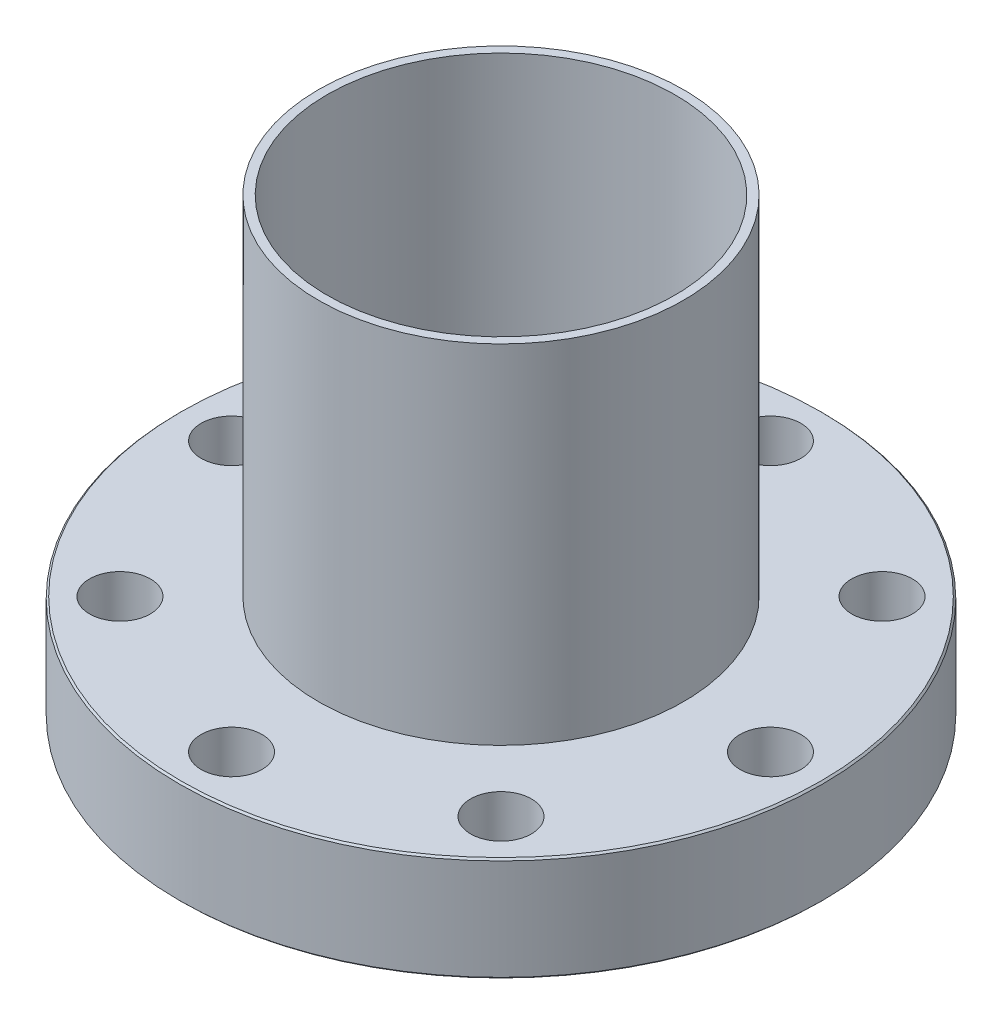
ISO-10303-21;
HEADER;
FILE_DESCRIPTION(('STEP AP214'),'2;1');
FILE_NAME('part.step','',(''),(''),'','','');
FILE_SCHEMA(('AUTOMOTIVE_DESIGN { 1 0 10303 214 1 1 1 1 }'));
ENDSEC;
DATA;
#1=APPLICATION_CONTEXT('core data for automotive mechanical design processes');
#2=APPLICATION_PROTOCOL_DEFINITION('international standard','automotive_design',2000,#1);
#3=PRODUCT_CONTEXT('',#1,'mechanical');
#4=PRODUCT('Part','Part','',(#3));
#5=PRODUCT_RELATED_PRODUCT_CATEGORY('part','',(#4));
#6=PRODUCT_DEFINITION_FORMATION('','',#4);
#7=PRODUCT_DEFINITION_CONTEXT('part definition',#1,'design');
#8=PRODUCT_DEFINITION('design','',#6,#7);
#9=PRODUCT_DEFINITION_SHAPE('','',#8);
#10=(LENGTH_UNIT() NAMED_UNIT(*) SI_UNIT(.MILLI.,.METRE.));
#11=(NAMED_UNIT(*) PLANE_ANGLE_UNIT() SI_UNIT($,.RADIAN.));
#12=(NAMED_UNIT(*) SI_UNIT($,.STERADIAN.) SOLID_ANGLE_UNIT());
#13=UNCERTAINTY_MEASURE_WITH_UNIT(LENGTH_MEASURE(1.E-05),#10,'distance_accuracy_value','');
#14=(GEOMETRIC_REPRESENTATION_CONTEXT(3) GLOBAL_UNCERTAINTY_ASSIGNED_CONTEXT((#13)) GLOBAL_UNIT_ASSIGNED_CONTEXT((#10,
#11,#12)) REPRESENTATION_CONTEXT('',''));
#15=CARTESIAN_POINT('',(0.,0.,0.));
#16=DIRECTION('',(0.,0.,1.));
#17=DIRECTION('',(1.,0.,0.));
#18=AXIS2_PLACEMENT_3D('',#15,#16,#17);
#19=CARTESIAN_POINT('',(10.96015510839,31.9085,10.96015510839));
#20=DIRECTION('',(0.,-1.,0.));
#21=DIRECTION('',(-0.707106781186548,0.,-0.707106781186548));
#22=AXIS2_PLACEMENT_3D('',#19,#20,#21);
#23=CYLINDRICAL_SURFACE('',#22,1.75);
#24=CARTESIAN_POINT('',(10.96015510839,7.7,10.96015510839));
#25=DIRECTION('',(0.,-1.,0.));
#26=DIRECTION('',(-0.707106781186548,0.,-0.707106781186548));
#27=AXIS2_PLACEMENT_3D('',#24,#25,#26);
#28=CIRCLE('',#27,1.75);
#29=CARTESIAN_POINT('',(12.1975919754665,7.7,12.1975919754665));
#30=VERTEX_POINT('',#29);
#31=EDGE_CURVE('E180',#30,#30,#28,.T.);
#32=ORIENTED_EDGE('',*,*,#31,.F.);
#33=DIRECTION('',(0.,-1.,0.));
#34=VECTOR('',#33,1.);
#35=CARTESIAN_POINT('',(12.1975919754665,31.9085,12.1975919754665));
#36=LINE('',#35,#34);
#37=CARTESIAN_POINT('',(12.1975919754665,1.7,12.1975919754665));
#38=VERTEX_POINT('',#37);
#39=EDGE_CURVE('E11',#30,#38,#36,.T.);
#40=ORIENTED_EDGE('',*,*,#39,.T.);
#41=CARTESIAN_POINT('',(10.96015510839,1.7,10.96015510839));
#42=DIRECTION('',(0.,-1.,0.));
#43=DIRECTION('',(-0.707106781186548,0.,-0.707106781186548));
#44=AXIS2_PLACEMENT_3D('',#41,#42,#43);
#45=CIRCLE('',#44,1.75);
#46=EDGE_CURVE('E211',#38,#38,#45,.T.);
#47=ORIENTED_EDGE('',*,*,#46,.T.);
#48=ORIENTED_EDGE('',*,*,#39,.F.);
#49=EDGE_LOOP('',(#32,#40,#47,#48));
#50=FACE_BOUND('',#49,.T.);
#51=ADVANCED_FACE('F17',(#50),#23,.F.);
#52=CARTESIAN_POINT('',(0.,31.9085,15.5));
#53=DIRECTION('',(0.,-1.,0.));
#54=DIRECTION('',(0.,0.,-1.));
#55=AXIS2_PLACEMENT_3D('',#52,#53,#54);
#56=CYLINDRICAL_SURFACE('',#55,1.75);
#57=CARTESIAN_POINT('',(0.,7.7,15.5));
#58=DIRECTION('',(0.,-1.,0.));
#59=DIRECTION('',(0.,0.,-1.));
#60=AXIS2_PLACEMENT_3D('',#57,#58,#59);
#61=CIRCLE('',#60,1.75);
#62=CARTESIAN_POINT('',(0.,7.7,17.25));
#63=VERTEX_POINT('',#62);
#64=EDGE_CURVE('E170',#63,#63,#61,.T.);
#65=ORIENTED_EDGE('',*,*,#64,.F.);
#66=DIRECTION('',(0.,-1.,0.));
#67=VECTOR('',#66,1.);
#68=CARTESIAN_POINT('',(0.,31.9085,17.25));
#69=LINE('',#68,#67);
#70=CARTESIAN_POINT('',(0.,1.7,17.25));
#71=VERTEX_POINT('',#70);
#72=EDGE_CURVE('E28',#63,#71,#69,.T.);
#73=ORIENTED_EDGE('',*,*,#72,.T.);
#74=CARTESIAN_POINT('',(0.,1.7,15.5));
#75=DIRECTION('',(0.,-1.,0.));
#76=DIRECTION('',(0.,0.,-1.));
#77=AXIS2_PLACEMENT_3D('',#74,#75,#76);
#78=CIRCLE('',#77,1.75);
#79=EDGE_CURVE('E172',#71,#71,#78,.T.);
#80=ORIENTED_EDGE('',*,*,#79,.T.);
#81=ORIENTED_EDGE('',*,*,#72,.F.);
#82=EDGE_LOOP('',(#65,#73,#80,#81));
#83=FACE_BOUND('',#82,.T.);
#84=ADVANCED_FACE('F169',(#83),#56,.F.);
#85=CARTESIAN_POINT('',(-10.96015510839,31.9085,10.96015510839));
#86=DIRECTION('',(0.,-1.,0.));
#87=DIRECTION('',(0.707106781186548,0.,-0.707106781186548));
#88=AXIS2_PLACEMENT_3D('',#85,#86,#87);
#89=CYLINDRICAL_SURFACE('',#88,1.75);
#90=CARTESIAN_POINT('',(-10.96015510839,7.7,10.96015510839));
#91=DIRECTION('',(0.,-1.,0.));
#92=DIRECTION('',(0.707106781186548,0.,-0.707106781186548));
#93=AXIS2_PLACEMENT_3D('',#90,#91,#92);
#94=CIRCLE('',#93,1.75);
#95=CARTESIAN_POINT('',(-12.1975919754665,7.7,12.1975919754665));
#96=VERTEX_POINT('',#95);
#97=EDGE_CURVE('E181',#96,#96,#94,.T.);
#98=ORIENTED_EDGE('',*,*,#97,.F.);
#99=DIRECTION('',(0.,-1.,0.));
#100=VECTOR('',#99,1.);
#101=CARTESIAN_POINT('',(-12.1975919754665,31.9085,12.1975919754665));
#102=LINE('',#101,#100);
#103=CARTESIAN_POINT('',(-12.1975919754665,1.7,12.1975919754665));
#104=VERTEX_POINT('',#103);
#105=EDGE_CURVE('E174',#96,#104,#102,.T.);
#106=ORIENTED_EDGE('',*,*,#105,.T.);
#107=CARTESIAN_POINT('',(-10.96015510839,1.7,10.96015510839));
#108=DIRECTION('',(0.,-1.,0.));
#109=DIRECTION('',(0.707106781186548,0.,-0.707106781186548));
#110=AXIS2_PLACEMENT_3D('',#107,#108,#109);
#111=CIRCLE('',#110,1.75);
#112=EDGE_CURVE('E198',#104,#104,#111,.T.);
#113=ORIENTED_EDGE('',*,*,#112,.T.);
#114=ORIENTED_EDGE('',*,*,#105,.F.);
#115=EDGE_LOOP('',(#98,#106,#113,#114));
#116=FACE_BOUND('',#115,.T.);
#117=ADVANCED_FACE('F389',(#116),#89,.F.);
#118=CARTESIAN_POINT('',(-15.5,31.9085,0.));
#119=DIRECTION('',(0.,-1.,0.));
#120=DIRECTION('',(1.,0.,0.));
#121=AXIS2_PLACEMENT_3D('',#118,#119,#120);
#122=CYLINDRICAL_SURFACE('',#121,1.75);
#123=CARTESIAN_POINT('',(-15.5,7.7,0.));
#124=DIRECTION('',(0.,-1.,0.));
#125=DIRECTION('',(1.,0.,0.));
#126=AXIS2_PLACEMENT_3D('',#123,#124,#125);
#127=CIRCLE('',#126,1.75);
#128=CARTESIAN_POINT('',(-17.25,7.7,0.));
#129=VERTEX_POINT('',#128);
#130=EDGE_CURVE('E192',#129,#129,#127,.T.);
#131=ORIENTED_EDGE('',*,*,#130,.F.);
#132=DIRECTION('',(0.,-1.,0.));
#133=VECTOR('',#132,1.);
#134=CARTESIAN_POINT('',(-17.25,31.9085,0.));
#135=LINE('',#134,#133);
#136=CARTESIAN_POINT('',(-17.25,1.7,0.));
#137=VERTEX_POINT('',#136);
#138=EDGE_CURVE('E259',#129,#137,#135,.T.);
#139=ORIENTED_EDGE('',*,*,#138,.T.);
#140=CARTESIAN_POINT('',(-15.5,1.7,0.));
#141=DIRECTION('',(0.,-1.,0.));
#142=DIRECTION('',(1.,0.,0.));
#143=AXIS2_PLACEMENT_3D('',#140,#141,#142);
#144=CIRCLE('',#143,1.75);
#145=EDGE_CURVE('E202',#137,#137,#144,.T.);
#146=ORIENTED_EDGE('',*,*,#145,.T.);
#147=ORIENTED_EDGE('',*,*,#138,.F.);
#148=EDGE_LOOP('',(#131,#139,#146,#147));
#149=FACE_BOUND('',#148,.T.);
#150=ADVANCED_FACE('F428',(#149),#122,.F.);
#151=CARTESIAN_POINT('',(-10.96015510839,31.9085,-10.96015510839));
#152=DIRECTION('',(0.,-1.,0.));
#153=DIRECTION('',(0.707106781186548,0.,0.707106781186548));
#154=AXIS2_PLACEMENT_3D('',#151,#152,#153);
#155=CYLINDRICAL_SURFACE('',#154,1.75);
#156=CARTESIAN_POINT('',(-10.96015510839,7.7,-10.96015510839));
#157=DIRECTION('',(0.,-1.,0.));
#158=DIRECTION('',(0.707106781186548,0.,0.707106781186548));
#159=AXIS2_PLACEMENT_3D('',#156,#157,#158);
#160=CIRCLE('',#159,1.75);
#161=CARTESIAN_POINT('',(-12.1975919754665,7.7,-12.1975919754665));
#162=VERTEX_POINT('',#161);
#163=EDGE_CURVE('E214',#162,#162,#160,.T.);
#164=ORIENTED_EDGE('',*,*,#163,.F.);
#165=DIRECTION('',(0.,-1.,0.));
#166=VECTOR('',#165,1.);
#167=CARTESIAN_POINT('',(-12.1975919754665,31.9085,-12.1975919754665));
#168=LINE('',#167,#166);
#169=CARTESIAN_POINT('',(-12.1975919754665,1.7,-12.1975919754665));
#170=VERTEX_POINT('',#169);
#171=EDGE_CURVE('E255',#162,#170,#168,.T.);
#172=ORIENTED_EDGE('',*,*,#171,.T.);
#173=CARTESIAN_POINT('',(-10.96015510839,1.7,-10.96015510839));
#174=DIRECTION('',(0.,-1.,0.));
#175=DIRECTION('',(0.707106781186548,0.,0.707106781186548));
#176=AXIS2_PLACEMENT_3D('',#173,#174,#175);
#177=CIRCLE('',#176,1.75);
#178=EDGE_CURVE('E270',#170,#170,#177,.T.);
#179=ORIENTED_EDGE('',*,*,#178,.T.);
#180=ORIENTED_EDGE('',*,*,#171,.F.);
#181=EDGE_LOOP('',(#164,#172,#179,#180));
#182=FACE_BOUND('',#181,.T.);
#183=ADVANCED_FACE('F339',(#182),#155,.F.);
#184=CARTESIAN_POINT('',(0.,31.9085,-15.5));
#185=DIRECTION('',(0.,-1.,0.));
#186=DIRECTION('',(0.,0.,1.));
#187=AXIS2_PLACEMENT_3D('',#184,#185,#186);
#188=CYLINDRICAL_SURFACE('',#187,1.75);
#189=CARTESIAN_POINT('',(0.,7.7,-15.5));
#190=DIRECTION('',(0.,-1.,0.));
#191=DIRECTION('',(0.,0.,1.));
#192=AXIS2_PLACEMENT_3D('',#189,#190,#191);
#193=CIRCLE('',#192,1.75);
#194=CARTESIAN_POINT('',(0.,7.7,-17.25));
#195=VERTEX_POINT('',#194);
#196=EDGE_CURVE('E218',#195,#195,#193,.T.);
#197=ORIENTED_EDGE('',*,*,#196,.F.);
#198=DIRECTION('',(0.,-1.,0.));
#199=VECTOR('',#198,1.);
#200=CARTESIAN_POINT('',(0.,31.9085,-17.25));
#201=LINE('',#200,#199);
#202=CARTESIAN_POINT('',(0.,1.7,-17.25));
#203=VERTEX_POINT('',#202);
#204=EDGE_CURVE('E251',#195,#203,#201,.T.);
#205=ORIENTED_EDGE('',*,*,#204,.T.);
#206=CARTESIAN_POINT('',(0.,1.7,-15.5));
#207=DIRECTION('',(0.,-1.,0.));
#208=DIRECTION('',(0.,0.,1.));
#209=AXIS2_PLACEMENT_3D('',#206,#207,#208);
#210=CIRCLE('',#209,1.75);
#211=EDGE_CURVE('E267',#203,#203,#210,.T.);
#212=ORIENTED_EDGE('',*,*,#211,.T.);
#213=ORIENTED_EDGE('',*,*,#204,.F.);
#214=EDGE_LOOP('',(#197,#205,#212,#213));
#215=FACE_BOUND('',#214,.T.);
#216=ADVANCED_FACE('F426',(#215),#188,.F.);
#217=CARTESIAN_POINT('',(10.96015510839,31.9085,-10.96015510839));
#218=DIRECTION('',(0.,-1.,0.));
#219=DIRECTION('',(-0.707106781186548,0.,0.707106781186548));
#220=AXIS2_PLACEMENT_3D('',#217,#218,#219);
#221=CYLINDRICAL_SURFACE('',#220,1.75);
#222=CARTESIAN_POINT('',(10.96015510839,7.7,-10.96015510839));
#223=DIRECTION('',(0.,-1.,0.));
#224=DIRECTION('',(-0.707106781186548,0.,0.707106781186548));
#225=AXIS2_PLACEMENT_3D('',#222,#223,#224);
#226=CIRCLE('',#225,1.75);
#227=CARTESIAN_POINT('',(12.1975919754665,7.7,-12.1975919754665));
#228=VERTEX_POINT('',#227);
#229=EDGE_CURVE('E240',#228,#228,#226,.T.);
#230=ORIENTED_EDGE('',*,*,#229,.F.);
#231=DIRECTION('',(0.,-1.,0.));
#232=VECTOR('',#231,1.);
#233=CARTESIAN_POINT('',(12.1975919754665,31.9085,-12.1975919754665));
#234=LINE('',#233,#232);
#235=CARTESIAN_POINT('',(12.1975919754665,1.7,-12.1975919754665));
#236=VERTEX_POINT('',#235);
#237=EDGE_CURVE('E248',#228,#236,#234,.T.);
#238=ORIENTED_EDGE('',*,*,#237,.T.);
#239=CARTESIAN_POINT('',(10.96015510839,1.7,-10.96015510839));
#240=DIRECTION('',(0.,-1.,0.));
#241=DIRECTION('',(-0.707106781186548,0.,0.707106781186548));
#242=AXIS2_PLACEMENT_3D('',#239,#240,#241);
#243=CIRCLE('',#242,1.75);
#244=EDGE_CURVE('E271',#236,#236,#243,.T.);
#245=ORIENTED_EDGE('',*,*,#244,.T.);
#246=ORIENTED_EDGE('',*,*,#237,.F.);
#247=EDGE_LOOP('',(#230,#238,#245,#246));
#248=FACE_BOUND('',#247,.T.);
#249=ADVANCED_FACE('F413',(#248),#221,.F.);
#250=CARTESIAN_POINT('',(15.5,31.9085,0.));
#251=DIRECTION('',(0.,-1.,0.));
#252=DIRECTION('',(-1.,0.,0.));
#253=AXIS2_PLACEMENT_3D('',#250,#251,#252);
#254=CYLINDRICAL_SURFACE('',#253,1.75);
#255=CARTESIAN_POINT('',(15.5,7.7,0.));
#256=DIRECTION('',(0.,-1.,0.));
#257=DIRECTION('',(-1.,0.,0.));
#258=AXIS2_PLACEMENT_3D('',#255,#256,#257);
#259=CIRCLE('',#258,1.75);
#260=CARTESIAN_POINT('',(17.25,7.7,0.));
#261=VERTEX_POINT('',#260);
#262=EDGE_CURVE('E262',#261,#261,#259,.T.);
#263=ORIENTED_EDGE('',*,*,#262,.F.);
#264=DIRECTION('',(0.,-1.,0.));
#265=VECTOR('',#264,1.);
#266=CARTESIAN_POINT('',(17.25,31.9085,0.));
#267=LINE('',#266,#265);
#268=CARTESIAN_POINT('',(17.25,1.7,0.));
#269=VERTEX_POINT('',#268);
#270=EDGE_CURVE('E245',#261,#269,#267,.T.);
#271=ORIENTED_EDGE('',*,*,#270,.T.);
#272=CARTESIAN_POINT('',(15.5,1.7,0.));
#273=DIRECTION('',(0.,-1.,0.));
#274=DIRECTION('',(-1.,0.,0.));
#275=AXIS2_PLACEMENT_3D('',#272,#273,#274);
#276=CIRCLE('',#275,1.75);
#277=EDGE_CURVE('E291',#269,#269,#276,.T.);
#278=ORIENTED_EDGE('',*,*,#277,.T.);
#279=ORIENTED_EDGE('',*,*,#270,.F.);
#280=EDGE_LOOP('',(#263,#271,#278,#279));
#281=FACE_BOUND('',#280,.T.);
#282=ADVANCED_FACE('F407',(#281),#254,.F.);
#283=CARTESIAN_POINT('',(0.,0.,0.));
#284=DIRECTION('',(0.,1.,0.));
#285=DIRECTION('',(1.,0.,0.));
#286=AXIS2_PLACEMENT_3D('',#283,#284,#285);
#287=PLANE('',#286);
#288=CARTESIAN_POINT('',(0.,0.,0.));
#289=DIRECTION('',(0.,-1.,0.));
#290=DIRECTION('',(1.,0.,0.));
#291=AXIS2_PLACEMENT_3D('',#288,#289,#290);
#292=CIRCLE('',#291,10.);
#293=CARTESIAN_POINT('',(-10.,0.,0.));
#294=VERTEX_POINT('',#293);
#295=EDGE_CURVE('E241',#294,#294,#292,.T.);
#296=ORIENTED_EDGE('',*,*,#295,.F.);
#297=EDGE_LOOP('',(#296));
#298=FACE_BOUND('',#297,.T.);
#299=CARTESIAN_POINT('',(0.,0.,0.));
#300=DIRECTION('',(0.,1.,0.));
#301=DIRECTION('',(1.,0.,0.));
#302=AXIS2_PLACEMENT_3D('',#299,#300,#301);
#303=CIRCLE('',#302,10.475);
#304=CARTESIAN_POINT('',(-10.475,0.,0.));
#305=VERTEX_POINT('',#304);
#306=EDGE_CURVE('E42',#305,#305,#303,.T.);
#307=ORIENTED_EDGE('',*,*,#306,.F.);
#308=EDGE_LOOP('',(#307));
#309=FACE_BOUND('',#308,.T.);
#310=ADVANCED_FACE('F401',(#298,#309),#287,.F.);
#311=CARTESIAN_POINT('',(0.,-1.385,0.));
#312=DIRECTION('',(0.,1.,0.));
#313=DIRECTION('',(1.,0.,0.));
#314=AXIS2_PLACEMENT_3D('',#311,#312,#313);
#315=CYLINDRICAL_SURFACE('',#314,10.475);
#316=CARTESIAN_POINT('',(0.,1.5,0.));
#317=DIRECTION('',(0.,1.,0.));
#318=DIRECTION('',(1.,0.,0.));
#319=AXIS2_PLACEMENT_3D('',#316,#317,#318);
#320=CIRCLE('',#319,10.475);
#321=CARTESIAN_POINT('',(-10.475,1.5,0.));
#322=VERTEX_POINT('',#321);
#323=EDGE_CURVE('E205',#322,#322,#320,.T.);
#324=ORIENTED_EDGE('',*,*,#323,.F.);
#325=DIRECTION('',(0.,-1.,0.));
#326=VECTOR('',#325,1.);
#327=CARTESIAN_POINT('',(-10.475,-1.385,0.));
#328=LINE('',#327,#326);
#329=EDGE_CURVE('E196',#322,#305,#328,.T.);
#330=ORIENTED_EDGE('',*,*,#329,.T.);
#331=ORIENTED_EDGE('',*,*,#306,.T.);
#332=ORIENTED_EDGE('',*,*,#329,.F.);
#333=EDGE_LOOP('',(#324,#330,#331,#332));
#334=FACE_BOUND('',#333,.T.);
#335=ADVANCED_FACE('F19',(#334),#315,.T.);
#336=CARTESIAN_POINT('',(0.,1.5,0.));
#337=DIRECTION('',(0.,1.,0.));
#338=DIRECTION('',(1.,0.,0.));
#339=AXIS2_PLACEMENT_3D('',#336,#337,#338);
#340=PLANE('',#339);
#341=ORIENTED_EDGE('',*,*,#323,.T.);
#342=EDGE_LOOP('',(#341));
#343=FACE_BOUND('',#342,.T.);
#344=CARTESIAN_POINT('',(0.,1.5,0.));
#345=DIRECTION('',(0.,1.,0.));
#346=DIRECTION('',(1.,0.,0.));
#347=AXIS2_PLACEMENT_3D('',#344,#345,#346);
#348=CIRCLE('',#347,13.);
#349=CARTESIAN_POINT('',(-13.,1.5,0.));
#350=VERTEX_POINT('',#349);
#351=EDGE_CURVE('E203',#350,#350,#348,.T.);
#352=ORIENTED_EDGE('',*,*,#351,.F.);
#353=EDGE_LOOP('',(#352));
#354=FACE_BOUND('',#353,.T.);
#355=ADVANCED_FACE('F393',(#343,#354),#340,.F.);
#356=CARTESIAN_POINT('',(0.,-1.385,0.));
#357=DIRECTION('',(0.,1.,0.));
#358=DIRECTION('',(1.,0.,0.));
#359=AXIS2_PLACEMENT_3D('',#356,#357,#358);
#360=CYLINDRICAL_SURFACE('',#359,13.);
#361=CARTESIAN_POINT('',(0.,1.7,0.));
#362=DIRECTION('',(0.,1.,0.));
#363=DIRECTION('',(1.,0.,0.));
#364=AXIS2_PLACEMENT_3D('',#361,#362,#363);
#365=CIRCLE('',#364,13.);
#366=CARTESIAN_POINT('',(-13.,1.7,0.));
#367=VERTEX_POINT('',#366);
#368=EDGE_CURVE('E295',#367,#367,#365,.T.);
#369=ORIENTED_EDGE('',*,*,#368,.F.);
#370=DIRECTION('',(0.,-1.,0.));
#371=VECTOR('',#370,1.);
#372=CARTESIAN_POINT('',(-13.,-1.385,0.));
#373=LINE('',#372,#371);
#374=EDGE_CURVE('E206',#367,#350,#373,.T.);
#375=ORIENTED_EDGE('',*,*,#374,.T.);
#376=ORIENTED_EDGE('',*,*,#351,.T.);
#377=ORIENTED_EDGE('',*,*,#374,.F.);
#378=EDGE_LOOP('',(#369,#375,#376,#377));
#379=FACE_BOUND('',#378,.T.);
#380=ADVANCED_FACE('F345',(#379),#360,.T.);
#381=CARTESIAN_POINT('',(0.,1.7,0.));
#382=DIRECTION('',(0.,1.,0.));
#383=DIRECTION('',(1.,0.,0.));
#384=AXIS2_PLACEMENT_3D('',#381,#382,#383);
#385=PLANE('',#384);
#386=ORIENTED_EDGE('',*,*,#46,.F.);
#387=EDGE_LOOP('',(#386));
#388=FACE_BOUND('',#387,.T.);
#389=ORIENTED_EDGE('',*,*,#79,.F.);
#390=EDGE_LOOP('',(#389));
#391=FACE_BOUND('',#390,.T.);
#392=ORIENTED_EDGE('',*,*,#112,.F.);
#393=EDGE_LOOP('',(#392));
#394=FACE_BOUND('',#393,.T.);
#395=ORIENTED_EDGE('',*,*,#145,.F.);
#396=EDGE_LOOP('',(#395));
#397=FACE_BOUND('',#396,.T.);
#398=ORIENTED_EDGE('',*,*,#178,.F.);
#399=EDGE_LOOP('',(#398));
#400=FACE_BOUND('',#399,.T.);
#401=ORIENTED_EDGE('',*,*,#211,.F.);
#402=EDGE_LOOP('',(#401));
#403=FACE_BOUND('',#402,.T.);
#404=ORIENTED_EDGE('',*,*,#244,.F.);
#405=EDGE_LOOP('',(#404));
#406=FACE_BOUND('',#405,.T.);
#407=ORIENTED_EDGE('',*,*,#277,.F.);
#408=EDGE_LOOP('',(#407));
#409=FACE_BOUND('',#408,.T.);
#410=ORIENTED_EDGE('',*,*,#368,.T.);
#411=EDGE_LOOP('',(#410));
#412=FACE_BOUND('',#411,.T.);
#413=CARTESIAN_POINT('',(1.698805748035E-13,1.700000086447,0.));
#414=DIRECTION('',(0.,1.,0.));
#415=DIRECTION('',(1.,0.,0.));
#416=AXIS2_PLACEMENT_3D('',#413,#414,#415);
#417=CIRCLE('',#416,18.39999837919);
#418=CARTESIAN_POINT('',(1.72136986382239E-13,1.70000008644632,18.3999983791907));
#419=VERTEX_POINT('',#418);
#420=EDGE_CURVE('E232',#419,#419,#417,.T.);
#421=ORIENTED_EDGE('',*,*,#420,.F.);
#422=EDGE_LOOP('',(#421));
#423=FACE_BOUND('',#422,.T.);
#424=ADVANCED_FACE('F341',(#388,#391,#394,#397,#400,#403,#406,#409,#412,#423),#385,.F.);
#425=CARTESIAN_POINT('',(1.698836364703E-13,1.750000898705,0.));
#426=DIRECTION('',(0.,1.,0.));
#427=DIRECTION('',(0.,0.,-1.));
#428=AXIS2_PLACEMENT_3D('',#425,#426,#427);
#429=CONICAL_SURFACE('',#428,18.44999918681,0.785398117004677);
#430=CARTESIAN_POINT('',(0.,1.800001547138,0.));
#431=DIRECTION('',(0.,1.,0.));
#432=DIRECTION('',(1.,0.,0.));
#433=AXIS2_PLACEMENT_3D('',#430,#431,#432);
#434=CIRCLE('',#433,18.5);
#435=CARTESIAN_POINT('',(1.7214923303835E-13,1.80000163183626,18.499999915302));
#436=VERTEX_POINT('',#435);
#437=CARTESIAN_POINT('',(-18.5,1.800001547138,0.));
#438=VERTEX_POINT('',#437);
#439=EDGE_CURVE('E233',#436,#438,#434,.T.);
#440=ORIENTED_EDGE('',*,*,#439,.F.);
#441=DIRECTION('',(0.,-0.70710681399119,-0.707106748381903));
#442=VECTOR('',#441,1.);
#443=CARTESIAN_POINT('',(1.7214310971514E-13,1.750000898705,18.44999918681));
#444=LINE('',#443,#442);
#445=EDGE_CURVE('E228',#436,#419,#444,.T.);
#446=ORIENTED_EDGE('',*,*,#445,.T.);
#447=ORIENTED_EDGE('',*,*,#420,.T.);
#448=ORIENTED_EDGE('',*,*,#445,.F.);
#449=CARTESIAN_POINT('',(0.,1.800001547138,0.));
#450=DIRECTION('',(0.,1.,0.));
#451=DIRECTION('',(1.,0.,0.));
#452=AXIS2_PLACEMENT_3D('',#449,#450,#451);
#453=CIRCLE('',#452,18.5);
#454=EDGE_CURVE('E227',#438,#436,#453,.T.);
#455=ORIENTED_EDGE('',*,*,#454,.F.);
#456=EDGE_LOOP('',(#440,#446,#447,#448,#455));
#457=FACE_BOUND('',#456,.T.);
#458=ADVANCED_FACE('F344',(#457),#429,.T.);
#459=CARTESIAN_POINT('',(0.,-1.385,0.));
#460=DIRECTION('',(0.,1.,0.));
#461=DIRECTION('',(1.,0.,0.));
#462=AXIS2_PLACEMENT_3D('',#459,#460,#461);
#463=CYLINDRICAL_SURFACE('',#462,18.5);
#464=CARTESIAN_POINT('',(0.,7.599998100525,0.));
#465=DIRECTION('',(0.,1.,0.));
#466=DIRECTION('',(-1.,0.,0.));
#467=AXIS2_PLACEMENT_3D('',#464,#465,#466);
#468=CIRCLE('',#467,18.5);
#469=CARTESIAN_POINT('',(-2.25439938230264E-13,7.59999798817781,18.4999998876532));
#470=VERTEX_POINT('',#469);
#471=CARTESIAN_POINT('',(-18.5,7.599998100525,0.));
#472=VERTEX_POINT('',#471);
#473=EDGE_CURVE('E189',#470,#472,#468,.T.);
#474=ORIENTED_EDGE('',*,*,#473,.F.);
#475=CARTESIAN_POINT('',(0.,7.599998100525,0.));
#476=DIRECTION('',(0.,1.,0.));
#477=DIRECTION('',(-1.,0.,0.));
#478=AXIS2_PLACEMENT_3D('',#475,#476,#477);
#479=CIRCLE('',#478,18.5);
#480=EDGE_CURVE('E223',#472,#470,#479,.T.);
#481=ORIENTED_EDGE('',*,*,#480,.F.);
#482=DIRECTION('',(0.,-1.,0.));
#483=VECTOR('',#482,1.);
#484=CARTESIAN_POINT('',(-18.5,-1.385,0.));
#485=LINE('',#484,#483);
#486=EDGE_CURVE('E222',#472,#438,#485,.T.);
#487=ORIENTED_EDGE('',*,*,#486,.T.);
#488=ORIENTED_EDGE('',*,*,#454,.T.);
#489=ORIENTED_EDGE('',*,*,#439,.T.);
#490=ORIENTED_EDGE('',*,*,#486,.F.);
#491=EDGE_LOOP('',(#474,#481,#487,#488,#489,#490));
#492=FACE_BOUND('',#491,.T.);
#493=ADVANCED_FACE('F367',(#492),#463,.T.);
#494=CARTESIAN_POINT('',(-2.231743416656E-13,7.649998883992,1.083577672034E-13));
#495=DIRECTION('',(0.,-1.,0.));
#496=DIRECTION('',(0.,0.,-1.));
#497=AXIS2_PLACEMENT_3D('',#494,#495,#496);
#498=CONICAL_SURFACE('',#497,18.44999899758,0.785398105987461);
#499=ORIENTED_EDGE('',*,*,#473,.T.);
#500=ORIENTED_EDGE('',*,*,#480,.T.);
#501=DIRECTION('',(0.,0.707106821781538,-0.707106740591555));
#502=VECTOR('',#501,1.);
#503=CARTESIAN_POINT('',(-2.25433814887266E-13,7.649998883992,18.4499989975801));
#504=LINE('',#503,#502);
#505=CARTESIAN_POINT('',(-2.25427691531314E-13,7.69999988558156,18.3999980017317));
#506=VERTEX_POINT('',#505);
#507=EDGE_CURVE('E219',#470,#506,#504,.T.);
#508=ORIENTED_EDGE('',*,*,#507,.T.);
#509=CARTESIAN_POINT('',(-2.231712799873E-13,7.69999988558,1.083577672034E-13));
#510=DIRECTION('',(0.,1.,0.));
#511=DIRECTION('',(-1.,0.,0.));
#512=AXIS2_PLACEMENT_3D('',#509,#510,#511);
#513=CIRCLE('',#512,18.39999800173);
#514=EDGE_CURVE('E266',#506,#506,#513,.T.);
#515=ORIENTED_EDGE('',*,*,#514,.F.);
#516=ORIENTED_EDGE('',*,*,#507,.F.);
#517=EDGE_LOOP('',(#499,#500,#508,#515,#516));
#518=FACE_BOUND('',#517,.T.);
#519=ADVANCED_FACE('F369',(#518),#498,.T.);
#520=CARTESIAN_POINT('',(0.,7.7,0.));
#521=DIRECTION('',(0.,1.,0.));
#522=DIRECTION('',(1.,0.,0.));
#523=AXIS2_PLACEMENT_3D('',#520,#521,#522);
#524=PLANE('',#523);
#525=ORIENTED_EDGE('',*,*,#31,.T.);
#526=EDGE_LOOP('',(#525));
#527=FACE_BOUND('',#526,.T.);
#528=ORIENTED_EDGE('',*,*,#64,.T.);
#529=EDGE_LOOP('',(#528));
#530=FACE_BOUND('',#529,.T.);
#531=ORIENTED_EDGE('',*,*,#97,.T.);
#532=EDGE_LOOP('',(#531));
#533=FACE_BOUND('',#532,.T.);
#534=ORIENTED_EDGE('',*,*,#130,.T.);
#535=EDGE_LOOP('',(#534));
#536=FACE_BOUND('',#535,.T.);
#537=ORIENTED_EDGE('',*,*,#163,.T.);
#538=EDGE_LOOP('',(#537));
#539=FACE_BOUND('',#538,.T.);
#540=ORIENTED_EDGE('',*,*,#196,.T.);
#541=EDGE_LOOP('',(#540));
#542=FACE_BOUND('',#541,.T.);
#543=ORIENTED_EDGE('',*,*,#229,.T.);
#544=EDGE_LOOP('',(#543));
#545=FACE_BOUND('',#544,.T.);
#546=ORIENTED_EDGE('',*,*,#262,.T.);
#547=EDGE_LOOP('',(#546));
#548=FACE_BOUND('',#547,.T.);
#549=CARTESIAN_POINT('',(0.,7.7,0.));
#550=DIRECTION('',(0.,1.,0.));
#551=DIRECTION('',(1.,0.,0.));
#552=AXIS2_PLACEMENT_3D('',#549,#550,#551);
#553=CIRCLE('',#552,10.5);
#554=CARTESIAN_POINT('',(-10.5,7.7,0.));
#555=VERTEX_POINT('',#554);
#556=EDGE_CURVE('E313',#555,#555,#553,.T.);
#557=ORIENTED_EDGE('',*,*,#556,.F.);
#558=EDGE_LOOP('',(#557));
#559=FACE_BOUND('',#558,.T.);
#560=ORIENTED_EDGE('',*,*,#514,.T.);
#561=EDGE_LOOP('',(#560));
#562=FACE_BOUND('',#561,.T.);
#563=ADVANCED_FACE('F177',(#527,#530,#533,#536,#539,#542,#545,#548,#559,#562),#524,.T.);
#564=CARTESIAN_POINT('',(0.,-1.385,0.));
#565=DIRECTION('',(0.,1.,0.));
#566=DIRECTION('',(1.,0.,0.));
#567=AXIS2_PLACEMENT_3D('',#564,#565,#566);
#568=CYLINDRICAL_SURFACE('',#567,10.5);
#569=CARTESIAN_POINT('',(0.,27.7,0.));
#570=DIRECTION('',(0.,1.,0.));
#571=DIRECTION('',(1.,0.,0.));
#572=AXIS2_PLACEMENT_3D('',#569,#570,#571);
#573=CIRCLE('',#572,10.5);
#574=CARTESIAN_POINT('',(-10.5,27.7,0.));
#575=VERTEX_POINT('',#574);
#576=EDGE_CURVE('E303',#575,#575,#573,.T.);
#577=ORIENTED_EDGE('',*,*,#576,.F.);
#578=DIRECTION('',(0.,-1.,0.));
#579=VECTOR('',#578,1.);
#580=CARTESIAN_POINT('',(-10.5,-1.385,0.));
#581=LINE('',#580,#579);
#582=EDGE_CURVE('E59',#575,#555,#581,.T.);
#583=ORIENTED_EDGE('',*,*,#582,.T.);
#584=ORIENTED_EDGE('',*,*,#556,.T.);
#585=ORIENTED_EDGE('',*,*,#582,.F.);
#586=EDGE_LOOP('',(#577,#583,#584,#585));
#587=FACE_BOUND('',#586,.T.);
#588=ADVANCED_FACE('F373',(#587),#568,.T.);
#589=CARTESIAN_POINT('',(0.,27.7,0.));
#590=DIRECTION('',(0.,1.,0.));
#591=DIRECTION('',(1.,0.,0.));
#592=AXIS2_PLACEMENT_3D('',#589,#590,#591);
#593=PLANE('',#592);
#594=CARTESIAN_POINT('',(0.,27.7,0.));
#595=DIRECTION('',(0.,1.,0.));
#596=DIRECTION('',(1.,0.,0.));
#597=AXIS2_PLACEMENT_3D('',#594,#595,#596);
#598=CIRCLE('',#597,10.);
#599=CARTESIAN_POINT('',(-10.,27.7,0.));
#600=VERTEX_POINT('',#599);
#601=EDGE_CURVE('E75',#600,#600,#598,.T.);
#602=ORIENTED_EDGE('',*,*,#601,.F.);
#603=EDGE_LOOP('',(#602));
#604=FACE_BOUND('',#603,.T.);
#605=ORIENTED_EDGE('',*,*,#576,.T.);
#606=EDGE_LOOP('',(#605));
#607=FACE_BOUND('',#606,.T.);
#608=ADVANCED_FACE('F380',(#604,#607),#593,.T.);
#609=CARTESIAN_POINT('',(0.,-1.385,0.));
#610=DIRECTION('',(0.,1.,0.));
#611=DIRECTION('',(1.,0.,0.));
#612=AXIS2_PLACEMENT_3D('',#609,#610,#611);
#613=CYLINDRICAL_SURFACE('',#612,10.);
#614=ORIENTED_EDGE('',*,*,#295,.T.);
#615=DIRECTION('',(0.,1.,0.));
#616=VECTOR('',#615,1.);
#617=CARTESIAN_POINT('',(-10.,-1.385,0.));
#618=LINE('',#617,#616);
#619=EDGE_CURVE('E21',#294,#600,#618,.T.);
#620=ORIENTED_EDGE('',*,*,#619,.T.);
#621=ORIENTED_EDGE('',*,*,#601,.T.);
#622=ORIENTED_EDGE('',*,*,#619,.F.);
#623=EDGE_LOOP('',(#614,#620,#621,#622));
#624=FACE_BOUND('',#623,.T.);
#625=ADVANCED_FACE('F421',(#624),#613,.F.);
#626=CLOSED_SHELL('',(#51,#84,#117,#150,#183,#216,#249,#282,#310,#335,#355,#380,#424,#458,#493,
#519,#563,#588,#608,#625));
#627=MANIFOLD_SOLID_BREP('B1',#626);
#628=ADVANCED_BREP_SHAPE_REPRESENTATION('',(#18,#627),#14);
#629=SHAPE_DEFINITION_REPRESENTATION(#9,#628);
ENDSEC;
END-ISO-10303-21;
